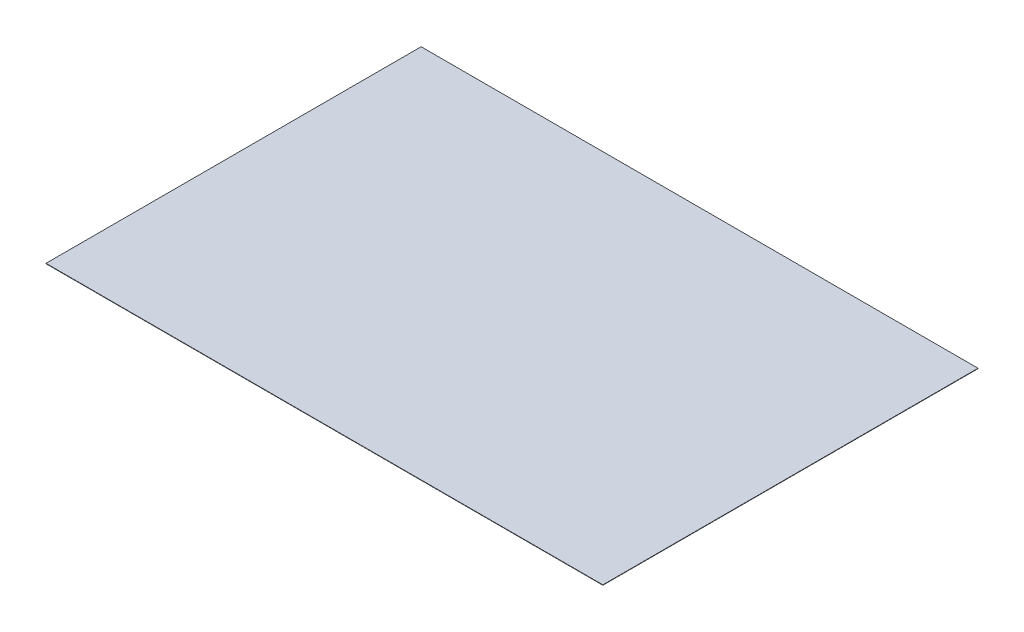
ISO-10303-21;
HEADER;
FILE_DESCRIPTION(('STEP AP214'),'2;1');
FILE_NAME('part.step','',(''),(''),'','','');
FILE_SCHEMA(('AUTOMOTIVE_DESIGN { 1 0 10303 214 1 1 1 1 }'));
ENDSEC;
DATA;
#1=APPLICATION_CONTEXT('core data for automotive mechanical design processes');
#2=APPLICATION_PROTOCOL_DEFINITION('international standard','automotive_design',2000,#1);
#3=PRODUCT_CONTEXT('',#1,'mechanical');
#4=PRODUCT('Part','Part','',(#3));
#5=PRODUCT_RELATED_PRODUCT_CATEGORY('part','',(#4));
#6=PRODUCT_DEFINITION_FORMATION('','',#4);
#7=PRODUCT_DEFINITION_CONTEXT('part definition',#1,'design');
#8=PRODUCT_DEFINITION('design','',#6,#7);
#9=PRODUCT_DEFINITION_SHAPE('','',#8);
#10=(LENGTH_UNIT() NAMED_UNIT(*) SI_UNIT(.MILLI.,.METRE.));
#11=(NAMED_UNIT(*) PLANE_ANGLE_UNIT() SI_UNIT($,.RADIAN.));
#12=(NAMED_UNIT(*) SI_UNIT($,.STERADIAN.) SOLID_ANGLE_UNIT());
#13=UNCERTAINTY_MEASURE_WITH_UNIT(LENGTH_MEASURE(1.E-05),#10,'distance_accuracy_value','');
#14=(GEOMETRIC_REPRESENTATION_CONTEXT(3) GLOBAL_UNCERTAINTY_ASSIGNED_CONTEXT((#13)) GLOBAL_UNIT_ASSIGNED_CONTEXT((#10,
#11,#12)) REPRESENTATION_CONTEXT('',''));
#15=CARTESIAN_POINT('',(0.,0.,0.));
#16=DIRECTION('',(0.,0.,1.));
#17=DIRECTION('',(1.,0.,0.));
#18=AXIS2_PLACEMENT_3D('',#15,#16,#17);
#19=CARTESIAN_POINT('',(74.,0.1,49.85));
#20=DIRECTION('',(-1.,0.,0.));
#21=DIRECTION('',(0.,0.,1.));
#22=AXIS2_PLACEMENT_3D('',#19,#20,#21);
#23=PLANE('',#22);
#24=DIRECTION('',(0.,0.,-1.));
#25=VECTOR('',#24,1.);
#26=CARTESIAN_POINT('',(74.,0.,49.85));
#27=LINE('',#26,#25);
#28=CARTESIAN_POINT('',(74.,0.,49.85));
#29=VERTEX_POINT('',#28);
#30=CARTESIAN_POINT('',(74.,0.,-49.85));
#31=VERTEX_POINT('',#30);
#32=EDGE_CURVE('E102',#29,#31,#27,.T.);
#33=ORIENTED_EDGE('',*,*,#32,.T.);
#34=DIRECTION('',(0.,-1.,0.));
#35=VECTOR('',#34,1.);
#36=CARTESIAN_POINT('',(74.,0.1,-49.85));
#37=LINE('',#36,#35);
#38=CARTESIAN_POINT('',(74.,0.1,-49.85));
#39=VERTEX_POINT('',#38);
#40=EDGE_CURVE('E11',#39,#31,#37,.T.);
#41=ORIENTED_EDGE('',*,*,#40,.F.);
#42=DIRECTION('',(0.,0.,-1.));
#43=VECTOR('',#42,1.);
#44=CARTESIAN_POINT('',(74.,0.1,49.85));
#45=LINE('',#44,#43);
#46=CARTESIAN_POINT('',(74.,0.1,49.85));
#47=VERTEX_POINT('',#46);
#48=EDGE_CURVE('E90',#47,#39,#45,.T.);
#49=ORIENTED_EDGE('',*,*,#48,.F.);
#50=DIRECTION('',(0.,-1.,0.));
#51=VECTOR('',#50,1.);
#52=CARTESIAN_POINT('',(74.,0.1,49.85));
#53=LINE('',#52,#51);
#54=EDGE_CURVE('E98',#47,#29,#53,.T.);
#55=ORIENTED_EDGE('',*,*,#54,.T.);
#56=EDGE_LOOP('',(#33,#41,#49,#55));
#57=FACE_BOUND('',#56,.T.);
#58=ADVANCED_FACE('F39',(#57),#23,.F.);
#59=CARTESIAN_POINT('',(-74.,0.1,-49.85));
#60=DIRECTION('',(0.,0.,1.));
#61=DIRECTION('',(1.,0.,0.));
#62=AXIS2_PLACEMENT_3D('',#59,#60,#61);
#63=PLANE('',#62);
#64=DIRECTION('',(-1.,0.,0.));
#65=VECTOR('',#64,1.);
#66=CARTESIAN_POINT('',(-74.,0.,-49.85));
#67=LINE('',#66,#65);
#68=CARTESIAN_POINT('',(-74.,0.,-49.85));
#69=VERTEX_POINT('',#68);
#70=EDGE_CURVE('E94',#31,#69,#67,.T.);
#71=ORIENTED_EDGE('',*,*,#70,.T.);
#72=DIRECTION('',(0.,-1.,0.));
#73=VECTOR('',#72,1.);
#74=CARTESIAN_POINT('',(-74.,0.1,-49.85));
#75=LINE('',#74,#73);
#76=CARTESIAN_POINT('',(-74.,0.1,-49.85));
#77=VERTEX_POINT('',#76);
#78=EDGE_CURVE('E47',#77,#69,#75,.T.);
#79=ORIENTED_EDGE('',*,*,#78,.F.);
#80=DIRECTION('',(-1.,0.,0.));
#81=VECTOR('',#80,1.);
#82=CARTESIAN_POINT('',(-74.,0.1,-49.85));
#83=LINE('',#82,#81);
#84=EDGE_CURVE('E85',#39,#77,#83,.T.);
#85=ORIENTED_EDGE('',*,*,#84,.F.);
#86=ORIENTED_EDGE('',*,*,#40,.T.);
#87=EDGE_LOOP('',(#71,#79,#85,#86));
#88=FACE_BOUND('',#87,.T.);
#89=ADVANCED_FACE('F93',(#88),#63,.F.);
#90=CARTESIAN_POINT('',(-74.,0.1,49.85));
#91=DIRECTION('',(1.,0.,0.));
#92=DIRECTION('',(0.,0.,-1.));
#93=AXIS2_PLACEMENT_3D('',#90,#91,#92);
#94=PLANE('',#93);
#95=DIRECTION('',(0.,0.,1.));
#96=VECTOR('',#95,1.);
#97=CARTESIAN_POINT('',(-74.,0.,49.85));
#98=LINE('',#97,#96);
#99=CARTESIAN_POINT('',(-74.,0.,49.85));
#100=VERTEX_POINT('',#99);
#101=EDGE_CURVE('E72',#69,#100,#98,.T.);
#102=ORIENTED_EDGE('',*,*,#101,.T.);
#103=DIRECTION('',(0.,-1.,0.));
#104=VECTOR('',#103,1.);
#105=CARTESIAN_POINT('',(-74.,0.1,49.85));
#106=LINE('',#105,#104);
#107=CARTESIAN_POINT('',(-74.,0.1,49.85));
#108=VERTEX_POINT('',#107);
#109=EDGE_CURVE('E95',#108,#100,#106,.T.);
#110=ORIENTED_EDGE('',*,*,#109,.F.);
#111=DIRECTION('',(0.,0.,1.));
#112=VECTOR('',#111,1.);
#113=CARTESIAN_POINT('',(-74.,0.1,49.85));
#114=LINE('',#113,#112);
#115=EDGE_CURVE('E88',#77,#108,#114,.T.);
#116=ORIENTED_EDGE('',*,*,#115,.F.);
#117=ORIENTED_EDGE('',*,*,#78,.T.);
#118=EDGE_LOOP('',(#102,#110,#116,#117));
#119=FACE_BOUND('',#118,.T.);
#120=ADVANCED_FACE('F96',(#119),#94,.F.);
#121=CARTESIAN_POINT('',(-74.,0.1,49.85));
#122=DIRECTION('',(0.,0.,-1.));
#123=DIRECTION('',(-1.,0.,0.));
#124=AXIS2_PLACEMENT_3D('',#121,#122,#123);
#125=PLANE('',#124);
#126=DIRECTION('',(1.,0.,0.));
#127=VECTOR('',#126,1.);
#128=CARTESIAN_POINT('',(-74.,0.,49.85));
#129=LINE('',#128,#127);
#130=EDGE_CURVE('E78',#100,#29,#129,.T.);
#131=ORIENTED_EDGE('',*,*,#130,.T.);
#132=ORIENTED_EDGE('',*,*,#54,.F.);
#133=DIRECTION('',(1.,0.,0.));
#134=VECTOR('',#133,1.);
#135=CARTESIAN_POINT('',(-74.,0.1,49.85));
#136=LINE('',#135,#134);
#137=EDGE_CURVE('E55',#108,#47,#136,.T.);
#138=ORIENTED_EDGE('',*,*,#137,.F.);
#139=ORIENTED_EDGE('',*,*,#109,.T.);
#140=EDGE_LOOP('',(#131,#132,#138,#139));
#141=FACE_BOUND('',#140,.T.);
#142=ADVANCED_FACE('F109',(#141),#125,.F.);
#143=CARTESIAN_POINT('',(0.,0.1,0.));
#144=DIRECTION('',(0.,-1.,0.));
#145=DIRECTION('',(0.,0.,-1.));
#146=AXIS2_PLACEMENT_3D('',#143,#144,#145);
#147=PLANE('',#146);
#148=ORIENTED_EDGE('',*,*,#48,.T.);
#149=ORIENTED_EDGE('',*,*,#84,.T.);
#150=ORIENTED_EDGE('',*,*,#115,.T.);
#151=ORIENTED_EDGE('',*,*,#137,.T.);
#152=EDGE_LOOP('',(#148,#149,#150,#151));
#153=FACE_BOUND('',#152,.T.);
#154=ADVANCED_FACE('F86',(#153),#147,.F.);
#155=CARTESIAN_POINT('',(0.,0.,0.));
#156=DIRECTION('',(0.,-1.,0.));
#157=DIRECTION('',(0.,0.,-1.));
#158=AXIS2_PLACEMENT_3D('',#155,#156,#157);
#159=PLANE('',#158);
#160=ORIENTED_EDGE('',*,*,#32,.F.);
#161=ORIENTED_EDGE('',*,*,#130,.F.);
#162=ORIENTED_EDGE('',*,*,#101,.F.);
#163=ORIENTED_EDGE('',*,*,#70,.F.);
#164=EDGE_LOOP('',(#160,#161,#162,#163));
#165=FACE_BOUND('',#164,.T.);
#166=ADVANCED_FACE('F112',(#165),#159,.T.);
#167=CLOSED_SHELL('',(#58,#89,#120,#142,#154,#166));
#168=MANIFOLD_SOLID_BREP('B2',#167);
#169=ADVANCED_BREP_SHAPE_REPRESENTATION('',(#18,#168),#14);
#170=SHAPE_DEFINITION_REPRESENTATION(#9,#169);
ENDSEC;
END-ISO-10303-21;
